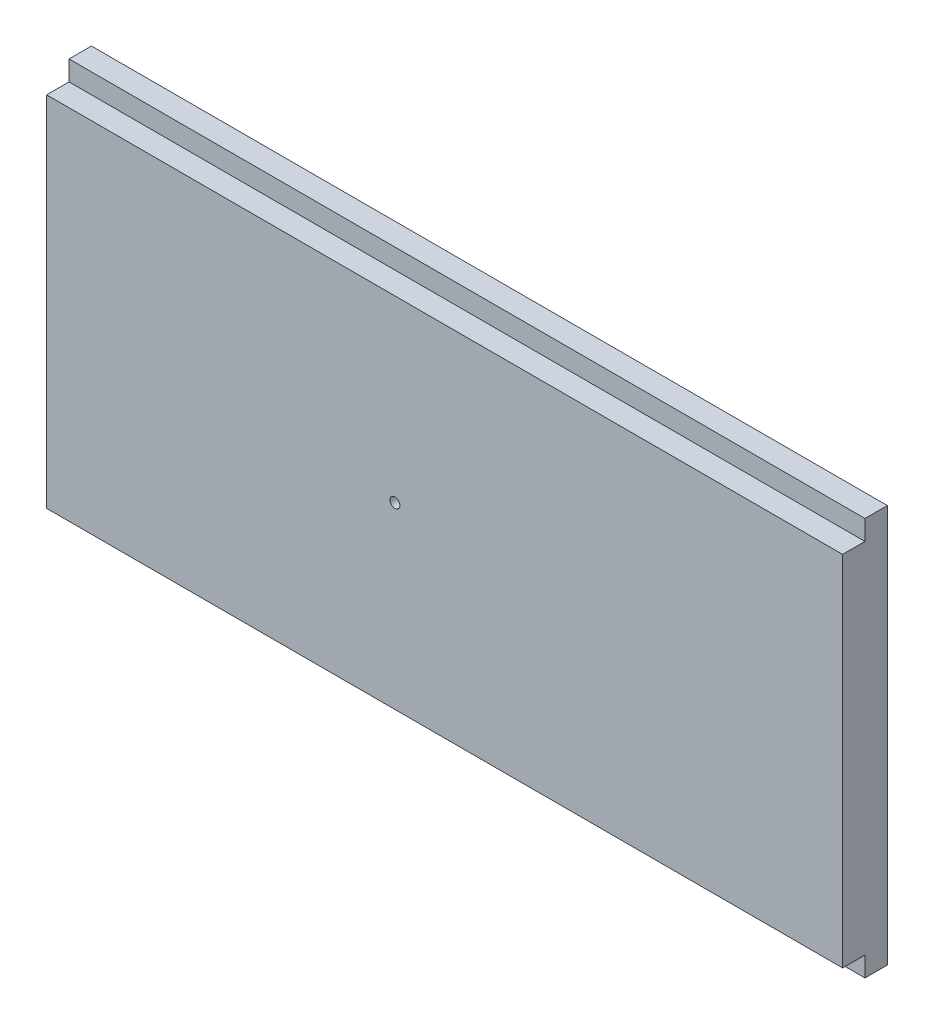
ISO-10303-21;
HEADER;
FILE_DESCRIPTION(('STEP AP214'),'2;1');
FILE_NAME('part.step','',(''),(''),'','','');
FILE_SCHEMA(('AUTOMOTIVE_DESIGN { 1 0 10303 214 1 1 1 1 }'));
ENDSEC;
DATA;
#1=APPLICATION_CONTEXT('core data for automotive mechanical design processes');
#2=APPLICATION_PROTOCOL_DEFINITION('international standard','automotive_design',2000,#1);
#3=PRODUCT_CONTEXT('',#1,'mechanical');
#4=PRODUCT('Part','Part','',(#3));
#5=PRODUCT_RELATED_PRODUCT_CATEGORY('part','',(#4));
#6=PRODUCT_DEFINITION_FORMATION('','',#4);
#7=PRODUCT_DEFINITION_CONTEXT('part definition',#1,'design');
#8=PRODUCT_DEFINITION('design','',#6,#7);
#9=PRODUCT_DEFINITION_SHAPE('','',#8);
#10=(LENGTH_UNIT() NAMED_UNIT(*) SI_UNIT(.MILLI.,.METRE.));
#11=(NAMED_UNIT(*) PLANE_ANGLE_UNIT() SI_UNIT($,.RADIAN.));
#12=(NAMED_UNIT(*) SI_UNIT($,.STERADIAN.) SOLID_ANGLE_UNIT());
#13=UNCERTAINTY_MEASURE_WITH_UNIT(LENGTH_MEASURE(1.E-05),#10,'distance_accuracy_value','');
#14=(GEOMETRIC_REPRESENTATION_CONTEXT(3) GLOBAL_UNCERTAINTY_ASSIGNED_CONTEXT((#13)) GLOBAL_UNIT_ASSIGNED_CONTEXT((#10,
#11,#12)) REPRESENTATION_CONTEXT('',''));
#15=CARTESIAN_POINT('',(0.,0.,0.));
#16=DIRECTION('',(0.,0.,1.));
#17=DIRECTION('',(1.,0.,0.));
#18=AXIS2_PLACEMENT_3D('',#15,#16,#17);
#19=CARTESIAN_POINT('',(0.,0.,4.5));
#20=DIRECTION('',(0.,-1.,0.));
#21=DIRECTION('',(1.,0.,0.));
#22=AXIS2_PLACEMENT_3D('',#19,#20,#21);
#23=PLANE('',#22);
#24=DIRECTION('',(-1.,0.,0.));
#25=VECTOR('',#24,1.);
#26=CARTESIAN_POINT('',(0.,0.,2.25));
#27=LINE('',#26,#25);
#28=CARTESIAN_POINT('',(0.,0.,2.25));
#29=VERTEX_POINT('',#28);
#30=CARTESIAN_POINT('',(-80.,0.,2.25));
#31=VERTEX_POINT('',#30);
#32=EDGE_CURVE('E185',#29,#31,#27,.T.);
#33=ORIENTED_EDGE('',*,*,#32,.T.);
#34=DIRECTION('',(0.,0.,-1.));
#35=VECTOR('',#34,1.);
#36=CARTESIAN_POINT('',(-80.,0.,4.5));
#37=LINE('',#36,#35);
#38=CARTESIAN_POINT('',(-80.,0.,0.));
#39=VERTEX_POINT('',#38);
#40=EDGE_CURVE('E48',#31,#39,#37,.T.);
#41=ORIENTED_EDGE('',*,*,#40,.T.);
#42=DIRECTION('',(-1.,0.,0.));
#43=VECTOR('',#42,1.);
#44=CARTESIAN_POINT('',(0.,0.,0.));
#45=LINE('',#44,#43);
#46=CARTESIAN_POINT('',(0.,0.,0.));
#47=VERTEX_POINT('',#46);
#48=EDGE_CURVE('E150',#47,#39,#45,.T.);
#49=ORIENTED_EDGE('',*,*,#48,.F.);
#50=DIRECTION('',(0.,0.,-1.));
#51=VECTOR('',#50,1.);
#52=CARTESIAN_POINT('',(0.,0.,4.5));
#53=LINE('',#52,#51);
#54=EDGE_CURVE('E11',#29,#47,#53,.T.);
#55=ORIENTED_EDGE('',*,*,#54,.F.);
#56=EDGE_LOOP('',(#33,#41,#49,#55));
#57=FACE_BOUND('',#56,.T.);
#58=ADVANCED_FACE('F45',(#57),#23,.T.);
#59=CARTESIAN_POINT('',(0.,0.,4.5));
#60=DIRECTION('',(-1.,0.,0.));
#61=DIRECTION('',(0.,0.,1.));
#62=AXIS2_PLACEMENT_3D('',#59,#60,#61);
#63=PLANE('',#62);
#64=DIRECTION('',(0.,-1.,0.));
#65=VECTOR('',#64,1.);
#66=CARTESIAN_POINT('',(0.,40.,2.25));
#67=LINE('',#66,#65);
#68=CARTESIAN_POINT('',(0.,40.,2.25));
#69=VERTEX_POINT('',#68);
#70=CARTESIAN_POINT('',(0.,38.,2.25));
#71=VERTEX_POINT('',#70);
#72=EDGE_CURVE('E110',#69,#71,#67,.T.);
#73=ORIENTED_EDGE('',*,*,#72,.T.);
#74=DIRECTION('',(0.,0.,1.));
#75=VECTOR('',#74,1.);
#76=CARTESIAN_POINT('',(0.,38.,4.5));
#77=LINE('',#76,#75);
#78=CARTESIAN_POINT('',(0.,38.,4.5));
#79=VERTEX_POINT('',#78);
#80=EDGE_CURVE('E122',#71,#79,#77,.T.);
#81=ORIENTED_EDGE('',*,*,#80,.T.);
#82=DIRECTION('',(0.,1.,0.));
#83=VECTOR('',#82,1.);
#84=CARTESIAN_POINT('',(0.,0.,4.5));
#85=LINE('',#84,#83);
#86=CARTESIAN_POINT('',(0.,1.99999999999999,4.5));
#87=VERTEX_POINT('',#86);
#88=EDGE_CURVE('E155',#87,#79,#85,.T.);
#89=ORIENTED_EDGE('',*,*,#88,.F.);
#90=DIRECTION('',(0.,0.,-1.));
#91=VECTOR('',#90,1.);
#92=CARTESIAN_POINT('',(0.,1.99999999999999,4.5));
#93=LINE('',#92,#91);
#94=CARTESIAN_POINT('',(0.,1.99999999999999,2.25));
#95=VERTEX_POINT('',#94);
#96=EDGE_CURVE('E70',#87,#95,#93,.T.);
#97=ORIENTED_EDGE('',*,*,#96,.T.);
#98=DIRECTION('',(0.,-1.,0.));
#99=VECTOR('',#98,1.);
#100=CARTESIAN_POINT('',(0.,0.,2.25));
#101=LINE('',#100,#99);
#102=EDGE_CURVE('E173',#95,#29,#101,.T.);
#103=ORIENTED_EDGE('',*,*,#102,.T.);
#104=ORIENTED_EDGE('',*,*,#54,.T.);
#105=DIRECTION('',(0.,1.,0.));
#106=VECTOR('',#105,1.);
#107=CARTESIAN_POINT('',(0.,0.,0.));
#108=LINE('',#107,#106);
#109=CARTESIAN_POINT('',(0.,40.,0.));
#110=VERTEX_POINT('',#109);
#111=EDGE_CURVE('E134',#47,#110,#108,.T.);
#112=ORIENTED_EDGE('',*,*,#111,.T.);
#113=DIRECTION('',(0.,0.,-1.));
#114=VECTOR('',#113,1.);
#115=CARTESIAN_POINT('',(0.,40.,4.5));
#116=LINE('',#115,#114);
#117=EDGE_CURVE('E54',#69,#110,#116,.T.);
#118=ORIENTED_EDGE('',*,*,#117,.F.);
#119=EDGE_LOOP('',(#73,#81,#89,#97,#103,#104,#112,#118));
#120=FACE_BOUND('',#119,.T.);
#121=ADVANCED_FACE('F132',(#120),#63,.F.);
#122=CARTESIAN_POINT('',(0.,40.,4.5));
#123=DIRECTION('',(0.,-1.,0.));
#124=DIRECTION('',(1.,0.,0.));
#125=AXIS2_PLACEMENT_3D('',#122,#123,#124);
#126=PLANE('',#125);
#127=DIRECTION('',(0.,0.,-1.));
#128=VECTOR('',#127,1.);
#129=CARTESIAN_POINT('',(-80.,40.,4.5));
#130=LINE('',#129,#128);
#131=CARTESIAN_POINT('',(-80.,40.,2.25));
#132=VERTEX_POINT('',#131);
#133=CARTESIAN_POINT('',(-80.,40.,0.));
#134=VERTEX_POINT('',#133);
#135=EDGE_CURVE('E129',#132,#134,#130,.T.);
#136=ORIENTED_EDGE('',*,*,#135,.F.);
#137=DIRECTION('',(-1.,0.,0.));
#138=VECTOR('',#137,1.);
#139=CARTESIAN_POINT('',(0.,40.,2.25));
#140=LINE('',#139,#138);
#141=EDGE_CURVE('E114',#69,#132,#140,.T.);
#142=ORIENTED_EDGE('',*,*,#141,.F.);
#143=ORIENTED_EDGE('',*,*,#117,.T.);
#144=DIRECTION('',(-1.,0.,0.));
#145=VECTOR('',#144,1.);
#146=CARTESIAN_POINT('',(0.,40.,0.));
#147=LINE('',#146,#145);
#148=EDGE_CURVE('E143',#110,#134,#147,.T.);
#149=ORIENTED_EDGE('',*,*,#148,.T.);
#150=EDGE_LOOP('',(#136,#142,#143,#149));
#151=FACE_BOUND('',#150,.T.);
#152=ADVANCED_FACE('F126',(#151),#126,.F.);
#153=CARTESIAN_POINT('',(-80.,0.,4.5));
#154=DIRECTION('',(-1.,0.,0.));
#155=DIRECTION('',(0.,0.,1.));
#156=AXIS2_PLACEMENT_3D('',#153,#154,#155);
#157=PLANE('',#156);
#158=DIRECTION('',(0.,0.,1.));
#159=VECTOR('',#158,1.);
#160=CARTESIAN_POINT('',(-80.,38.,4.5));
#161=LINE('',#160,#159);
#162=CARTESIAN_POINT('',(-80.,38.,2.25));
#163=VERTEX_POINT('',#162);
#164=CARTESIAN_POINT('',(-80.,38.,4.5));
#165=VERTEX_POINT('',#164);
#166=EDGE_CURVE('E62',#163,#165,#161,.T.);
#167=ORIENTED_EDGE('',*,*,#166,.F.);
#168=DIRECTION('',(0.,-1.,0.));
#169=VECTOR('',#168,1.);
#170=CARTESIAN_POINT('',(-80.,40.,2.25));
#171=LINE('',#170,#169);
#172=EDGE_CURVE('E182',#132,#163,#171,.T.);
#173=ORIENTED_EDGE('',*,*,#172,.F.);
#174=ORIENTED_EDGE('',*,*,#135,.T.);
#175=DIRECTION('',(0.,1.,0.));
#176=VECTOR('',#175,1.);
#177=CARTESIAN_POINT('',(-80.,0.,0.));
#178=LINE('',#177,#176);
#179=EDGE_CURVE('E146',#39,#134,#178,.T.);
#180=ORIENTED_EDGE('',*,*,#179,.F.);
#181=ORIENTED_EDGE('',*,*,#40,.F.);
#182=DIRECTION('',(0.,-1.,0.));
#183=VECTOR('',#182,1.);
#184=CARTESIAN_POINT('',(-80.,0.,2.25));
#185=LINE('',#184,#183);
#186=CARTESIAN_POINT('',(-80.,1.99999999999999,2.25));
#187=VERTEX_POINT('',#186);
#188=EDGE_CURVE('E172',#187,#31,#185,.T.);
#189=ORIENTED_EDGE('',*,*,#188,.F.);
#190=DIRECTION('',(0.,0.,-1.));
#191=VECTOR('',#190,1.);
#192=CARTESIAN_POINT('',(-80.,1.99999999999999,4.5));
#193=LINE('',#192,#191);
#194=CARTESIAN_POINT('',(-80.,1.99999999999999,4.5));
#195=VERTEX_POINT('',#194);
#196=EDGE_CURVE('E178',#195,#187,#193,.T.);
#197=ORIENTED_EDGE('',*,*,#196,.F.);
#198=DIRECTION('',(0.,1.,0.));
#199=VECTOR('',#198,1.);
#200=CARTESIAN_POINT('',(-80.,0.,4.5));
#201=LINE('',#200,#199);
#202=EDGE_CURVE('E142',#195,#165,#201,.T.);
#203=ORIENTED_EDGE('',*,*,#202,.T.);
#204=EDGE_LOOP('',(#167,#173,#174,#180,#181,#189,#197,#203));
#205=FACE_BOUND('',#204,.T.);
#206=ADVANCED_FACE('F211',(#205),#157,.T.);
#207=CARTESIAN_POINT('',(0.,0.,4.5));
#208=DIRECTION('',(0.,0.,-1.));
#209=DIRECTION('',(-1.,0.,0.));
#210=AXIS2_PLACEMENT_3D('',#207,#208,#209);
#211=PLANE('',#210);
#212=CARTESIAN_POINT('',(-45.,20.,4.5));
#213=DIRECTION('',(0.,0.,1.));
#214=DIRECTION('',(1.,0.,0.));
#215=AXIS2_PLACEMENT_3D('',#212,#213,#214);
#216=CIRCLE('',#215,0.499999999999999);
#217=CARTESIAN_POINT('',(-44.5,20.,4.5));
#218=VERTEX_POINT('',#217);
#219=EDGE_CURVE('E162',#218,#218,#216,.T.);
#220=ORIENTED_EDGE('',*,*,#219,.F.);
#221=EDGE_LOOP('',(#220));
#222=FACE_BOUND('',#221,.T.);
#223=ORIENTED_EDGE('',*,*,#88,.T.);
#224=DIRECTION('',(-1.,0.,0.));
#225=VECTOR('',#224,1.);
#226=CARTESIAN_POINT('',(0.,38.,4.5));
#227=LINE('',#226,#225);
#228=EDGE_CURVE('E166',#79,#165,#227,.T.);
#229=ORIENTED_EDGE('',*,*,#228,.T.);
#230=ORIENTED_EDGE('',*,*,#202,.F.);
#231=DIRECTION('',(-1.,0.,0.));
#232=VECTOR('',#231,1.);
#233=CARTESIAN_POINT('',(0.,1.99999999999999,4.5));
#234=LINE('',#233,#232);
#235=EDGE_CURVE('E177',#87,#195,#234,.T.);
#236=ORIENTED_EDGE('',*,*,#235,.F.);
#237=EDGE_LOOP('',(#223,#229,#230,#236));
#238=FACE_BOUND('',#237,.T.);
#239=ADVANCED_FACE('F205',(#222,#238),#211,.F.);
#240=CARTESIAN_POINT('',(0.,0.,0.));
#241=DIRECTION('',(0.,0.,-1.));
#242=DIRECTION('',(-1.,0.,0.));
#243=AXIS2_PLACEMENT_3D('',#240,#241,#242);
#244=PLANE('',#243);
#245=CARTESIAN_POINT('',(-45.,20.,0.));
#246=DIRECTION('',(0.,0.,1.));
#247=DIRECTION('',(1.,0.,0.));
#248=AXIS2_PLACEMENT_3D('',#245,#246,#247);
#249=CIRCLE('',#248,0.499999999999999);
#250=CARTESIAN_POINT('',(-44.5,20.,0.));
#251=VERTEX_POINT('',#250);
#252=EDGE_CURVE('E154',#251,#251,#249,.T.);
#253=ORIENTED_EDGE('',*,*,#252,.T.);
#254=EDGE_LOOP('',(#253));
#255=FACE_BOUND('',#254,.T.);
#256=ORIENTED_EDGE('',*,*,#48,.T.);
#257=ORIENTED_EDGE('',*,*,#179,.T.);
#258=ORIENTED_EDGE('',*,*,#148,.F.);
#259=ORIENTED_EDGE('',*,*,#111,.F.);
#260=EDGE_LOOP('',(#256,#257,#258,#259));
#261=FACE_BOUND('',#260,.T.);
#262=ADVANCED_FACE('F221',(#255,#261),#244,.T.);
#263=CARTESIAN_POINT('',(-45.,20.,0.));
#264=DIRECTION('',(0.,0.,1.));
#265=DIRECTION('',(1.,0.,0.));
#266=AXIS2_PLACEMENT_3D('',#263,#264,#265);
#267=CYLINDRICAL_SURFACE('',#266,0.499999999999999);
#268=ORIENTED_EDGE('',*,*,#252,.F.);
#269=EDGE_LOOP('',(#268));
#270=FACE_BOUND('',#269,.T.);
#271=ORIENTED_EDGE('',*,*,#219,.T.);
#272=EDGE_LOOP('',(#271));
#273=FACE_BOUND('',#272,.T.);
#274=ADVANCED_FACE('F223',(#270,#273),#267,.F.);
#275=CARTESIAN_POINT('',(0.,0.,2.25));
#276=DIRECTION('',(0.,0.,-1.));
#277=DIRECTION('',(-1.,0.,0.));
#278=AXIS2_PLACEMENT_3D('',#275,#276,#277);
#279=PLANE('',#278);
#280=ORIENTED_EDGE('',*,*,#188,.T.);
#281=ORIENTED_EDGE('',*,*,#32,.F.);
#282=ORIENTED_EDGE('',*,*,#102,.F.);
#283=DIRECTION('',(-1.,0.,0.));
#284=VECTOR('',#283,1.);
#285=CARTESIAN_POINT('',(0.,1.99999999999999,2.25));
#286=LINE('',#285,#284);
#287=EDGE_CURVE('E189',#95,#187,#286,.T.);
#288=ORIENTED_EDGE('',*,*,#287,.T.);
#289=EDGE_LOOP('',(#280,#281,#282,#288));
#290=FACE_BOUND('',#289,.T.);
#291=ADVANCED_FACE('F215',(#290),#279,.F.);
#292=CARTESIAN_POINT('',(0.,1.99999999999999,4.5));
#293=DIRECTION('',(0.,1.,0.));
#294=DIRECTION('',(0.,0.,1.));
#295=AXIS2_PLACEMENT_3D('',#292,#293,#294);
#296=PLANE('',#295);
#297=ORIENTED_EDGE('',*,*,#196,.T.);
#298=ORIENTED_EDGE('',*,*,#287,.F.);
#299=ORIENTED_EDGE('',*,*,#96,.F.);
#300=ORIENTED_EDGE('',*,*,#235,.T.);
#301=EDGE_LOOP('',(#297,#298,#299,#300));
#302=FACE_BOUND('',#301,.T.);
#303=ADVANCED_FACE('F208',(#302),#296,.F.);
#304=CARTESIAN_POINT('',(0.,38.,4.5));
#305=DIRECTION('',(0.,-1.,0.));
#306=DIRECTION('',(0.,0.,-1.));
#307=AXIS2_PLACEMENT_3D('',#304,#305,#306);
#308=PLANE('',#307);
#309=ORIENTED_EDGE('',*,*,#166,.T.);
#310=ORIENTED_EDGE('',*,*,#228,.F.);
#311=ORIENTED_EDGE('',*,*,#80,.F.);
#312=DIRECTION('',(-1.,0.,0.));
#313=VECTOR('',#312,1.);
#314=CARTESIAN_POINT('',(0.,38.,2.25));
#315=LINE('',#314,#313);
#316=EDGE_CURVE('E116',#71,#163,#315,.T.);
#317=ORIENTED_EDGE('',*,*,#316,.T.);
#318=EDGE_LOOP('',(#309,#310,#311,#317));
#319=FACE_BOUND('',#318,.T.);
#320=ADVANCED_FACE('F268',(#319),#308,.F.);
#321=CARTESIAN_POINT('',(0.,40.,2.25));
#322=DIRECTION('',(0.,0.,-1.));
#323=DIRECTION('',(-1.,0.,0.));
#324=AXIS2_PLACEMENT_3D('',#321,#322,#323);
#325=PLANE('',#324);
#326=ORIENTED_EDGE('',*,*,#172,.T.);
#327=ORIENTED_EDGE('',*,*,#316,.F.);
#328=ORIENTED_EDGE('',*,*,#72,.F.);
#329=ORIENTED_EDGE('',*,*,#141,.T.);
#330=EDGE_LOOP('',(#326,#327,#328,#329));
#331=FACE_BOUND('',#330,.T.);
#332=ADVANCED_FACE('F113',(#331),#325,.F.);
#333=CLOSED_SHELL('',(#58,#121,#152,#206,#239,#262,#274,#291,#303,#320,#332));
#334=MANIFOLD_SOLID_BREP('B2',#333);
#335=ADVANCED_BREP_SHAPE_REPRESENTATION('',(#18,#334),#14);
#336=SHAPE_DEFINITION_REPRESENTATION(#9,#335);
ENDSEC;
END-ISO-10303-21;
